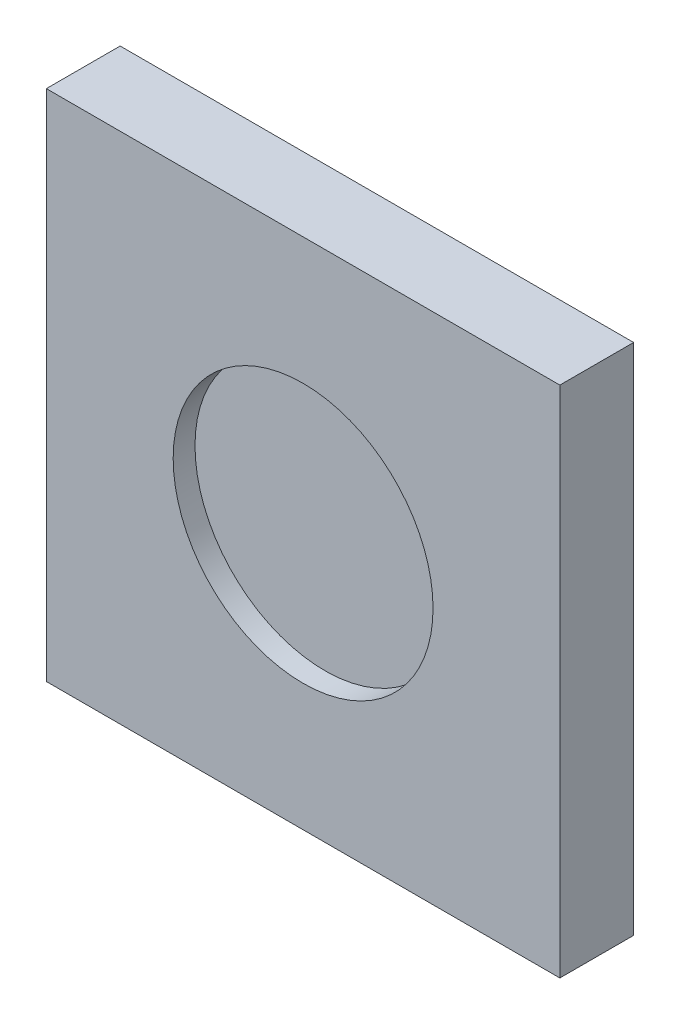
ISO-10303-21;
HEADER;
FILE_DESCRIPTION(('STEP AP214'),'2;1');
FILE_NAME('part.step','',(''),(''),'','','');
FILE_SCHEMA(('AUTOMOTIVE_DESIGN { 1 0 10303 214 1 1 1 1 }'));
ENDSEC;
DATA;
#1=APPLICATION_CONTEXT('core data for automotive mechanical design processes');
#2=APPLICATION_PROTOCOL_DEFINITION('international standard','automotive_design',2000,#1);
#3=PRODUCT_CONTEXT('',#1,'mechanical');
#4=PRODUCT('Part','Part','',(#3));
#5=PRODUCT_RELATED_PRODUCT_CATEGORY('part','',(#4));
#6=PRODUCT_DEFINITION_FORMATION('','',#4);
#7=PRODUCT_DEFINITION_CONTEXT('part definition',#1,'design');
#8=PRODUCT_DEFINITION('design','',#6,#7);
#9=PRODUCT_DEFINITION_SHAPE('','',#8);
#10=(LENGTH_UNIT() NAMED_UNIT(*) SI_UNIT(.MILLI.,.METRE.));
#11=(NAMED_UNIT(*) PLANE_ANGLE_UNIT() SI_UNIT($,.RADIAN.));
#12=(NAMED_UNIT(*) SI_UNIT($,.STERADIAN.) SOLID_ANGLE_UNIT());
#13=UNCERTAINTY_MEASURE_WITH_UNIT(LENGTH_MEASURE(1.E-05),#10,'distance_accuracy_value','');
#14=(GEOMETRIC_REPRESENTATION_CONTEXT(3) GLOBAL_UNCERTAINTY_ASSIGNED_CONTEXT((#13)) GLOBAL_UNIT_ASSIGNED_CONTEXT((#10,
#11,#12)) REPRESENTATION_CONTEXT('',''));
#15=CARTESIAN_POINT('',(0.,0.,0.));
#16=DIRECTION('',(0.,0.,1.));
#17=DIRECTION('',(1.,0.,0.));
#18=AXIS2_PLACEMENT_3D('',#15,#16,#17);
#19=CARTESIAN_POINT('',(24.7,24.7,7.1));
#20=DIRECTION('',(0.,0.,-1.));
#21=DIRECTION('',(-1.,0.,0.));
#22=AXIS2_PLACEMENT_3D('',#19,#20,#21);
#23=CYLINDRICAL_SURFACE('',#22,12.5);
#24=CARTESIAN_POINT('',(24.7,24.7,7.1));
#25=DIRECTION('',(0.,0.,1.));
#26=DIRECTION('',(1.,0.,0.));
#27=AXIS2_PLACEMENT_3D('',#24,#25,#26);
#28=CIRCLE('',#27,12.5);
#29=CARTESIAN_POINT('',(37.2,24.7,7.1));
#30=VERTEX_POINT('',#29);
#31=EDGE_CURVE('E100',#30,#30,#28,.T.);
#32=ORIENTED_EDGE('',*,*,#31,.T.);
#33=EDGE_LOOP('',(#32));
#34=FACE_BOUND('',#33,.T.);
#35=CARTESIAN_POINT('',(24.7,24.7,5.));
#36=DIRECTION('',(0.,0.,-1.));
#37=DIRECTION('',(-1.,0.,0.));
#38=AXIS2_PLACEMENT_3D('',#35,#36,#37);
#39=CIRCLE('',#38,12.5);
#40=CARTESIAN_POINT('',(12.2,24.7,5.));
#41=VERTEX_POINT('',#40);
#42=EDGE_CURVE('E113',#41,#41,#39,.T.);
#43=ORIENTED_EDGE('',*,*,#42,.T.);
#44=EDGE_LOOP('',(#43));
#45=FACE_BOUND('',#44,.T.);
#46=ADVANCED_FACE('F32',(#34,#45),#23,.F.);
#47=CARTESIAN_POINT('',(0.,49.4,7.1));
#48=DIRECTION('',(0.,0.,-1.));
#49=DIRECTION('',(-1.,0.,0.));
#50=AXIS2_PLACEMENT_3D('',#47,#48,#49);
#51=PLANE('',#50);
#52=DIRECTION('',(0.,-1.,0.));
#53=VECTOR('',#52,1.);
#54=CARTESIAN_POINT('',(0.,0.,7.1));
#55=LINE('',#54,#53);
#56=CARTESIAN_POINT('',(0.,49.4,7.1));
#57=VERTEX_POINT('',#56);
#58=CARTESIAN_POINT('',(0.,0.,7.1));
#59=VERTEX_POINT('',#58);
#60=EDGE_CURVE('E85',#57,#59,#55,.T.);
#61=ORIENTED_EDGE('',*,*,#60,.T.);
#62=DIRECTION('',(1.,0.,0.));
#63=VECTOR('',#62,1.);
#64=CARTESIAN_POINT('',(0.,0.,7.1));
#65=LINE('',#64,#63);
#66=CARTESIAN_POINT('',(49.4,0.,7.1));
#67=VERTEX_POINT('',#66);
#68=EDGE_CURVE('E79',#59,#67,#65,.T.);
#69=ORIENTED_EDGE('',*,*,#68,.T.);
#70=DIRECTION('',(0.,1.,0.));
#71=VECTOR('',#70,1.);
#72=CARTESIAN_POINT('',(49.4,0.,7.1));
#73=LINE('',#72,#71);
#74=CARTESIAN_POINT('',(49.4,49.4,7.1));
#75=VERTEX_POINT('',#74);
#76=EDGE_CURVE('E83',#67,#75,#73,.T.);
#77=ORIENTED_EDGE('',*,*,#76,.T.);
#78=DIRECTION('',(-1.,0.,0.));
#79=VECTOR('',#78,1.);
#80=CARTESIAN_POINT('',(0.,49.4,7.1));
#81=LINE('',#80,#79);
#82=EDGE_CURVE('E49',#75,#57,#81,.T.);
#83=ORIENTED_EDGE('',*,*,#82,.T.);
#84=EDGE_LOOP('',(#61,#69,#77,#83));
#85=FACE_BOUND('',#84,.T.);
#86=ORIENTED_EDGE('',*,*,#31,.F.);
#87=EDGE_LOOP('',(#86));
#88=FACE_BOUND('',#87,.T.);
#89=ADVANCED_FACE('F80',(#85,#88),#51,.F.);
#90=CARTESIAN_POINT('',(0.,49.4,0.));
#91=DIRECTION('',(0.,0.,-1.));
#92=DIRECTION('',(-1.,0.,0.));
#93=AXIS2_PLACEMENT_3D('',#90,#91,#92);
#94=PLANE('',#93);
#95=DIRECTION('',(0.,-1.,0.));
#96=VECTOR('',#95,1.);
#97=CARTESIAN_POINT('',(0.,0.,0.));
#98=LINE('',#97,#96);
#99=CARTESIAN_POINT('',(0.,49.4,0.));
#100=VERTEX_POINT('',#99);
#101=CARTESIAN_POINT('',(0.,0.,0.));
#102=VERTEX_POINT('',#101);
#103=EDGE_CURVE('E97',#100,#102,#98,.T.);
#104=ORIENTED_EDGE('',*,*,#103,.F.);
#105=DIRECTION('',(-1.,0.,0.));
#106=VECTOR('',#105,1.);
#107=CARTESIAN_POINT('',(0.,49.4,0.));
#108=LINE('',#107,#106);
#109=CARTESIAN_POINT('',(49.4,49.4,0.));
#110=VERTEX_POINT('',#109);
#111=EDGE_CURVE('E72',#110,#100,#108,.T.);
#112=ORIENTED_EDGE('',*,*,#111,.F.);
#113=DIRECTION('',(0.,1.,0.));
#114=VECTOR('',#113,1.);
#115=CARTESIAN_POINT('',(49.4,0.,0.));
#116=LINE('',#115,#114);
#117=CARTESIAN_POINT('',(49.4,0.,0.));
#118=VERTEX_POINT('',#117);
#119=EDGE_CURVE('E66',#118,#110,#116,.T.);
#120=ORIENTED_EDGE('',*,*,#119,.F.);
#121=DIRECTION('',(1.,0.,0.));
#122=VECTOR('',#121,1.);
#123=CARTESIAN_POINT('',(0.,0.,0.));
#124=LINE('',#123,#122);
#125=EDGE_CURVE('E89',#102,#118,#124,.T.);
#126=ORIENTED_EDGE('',*,*,#125,.F.);
#127=EDGE_LOOP('',(#104,#112,#120,#126));
#128=FACE_BOUND('',#127,.T.);
#129=ADVANCED_FACE('F108',(#128),#94,.T.);
#130=CARTESIAN_POINT('',(0.,0.,7.1));
#131=DIRECTION('',(1.,0.,0.));
#132=DIRECTION('',(0.,0.,-1.));
#133=AXIS2_PLACEMENT_3D('',#130,#131,#132);
#134=PLANE('',#133);
#135=ORIENTED_EDGE('',*,*,#103,.T.);
#136=DIRECTION('',(0.,0.,-1.));
#137=VECTOR('',#136,1.);
#138=CARTESIAN_POINT('',(0.,0.,7.1));
#139=LINE('',#138,#137);
#140=EDGE_CURVE('E11',#59,#102,#139,.T.);
#141=ORIENTED_EDGE('',*,*,#140,.F.);
#142=ORIENTED_EDGE('',*,*,#60,.F.);
#143=DIRECTION('',(0.,0.,-1.));
#144=VECTOR('',#143,1.);
#145=CARTESIAN_POINT('',(0.,49.4,7.1));
#146=LINE('',#145,#144);
#147=EDGE_CURVE('E93',#57,#100,#146,.T.);
#148=ORIENTED_EDGE('',*,*,#147,.T.);
#149=EDGE_LOOP('',(#135,#141,#142,#148));
#150=FACE_BOUND('',#149,.T.);
#151=ADVANCED_FACE('F34',(#150),#134,.F.);
#152=CARTESIAN_POINT('',(0.,0.,7.1));
#153=DIRECTION('',(0.,1.,0.));
#154=DIRECTION('',(0.,0.,1.));
#155=AXIS2_PLACEMENT_3D('',#152,#153,#154);
#156=PLANE('',#155);
#157=ORIENTED_EDGE('',*,*,#125,.T.);
#158=DIRECTION('',(0.,0.,-1.));
#159=VECTOR('',#158,1.);
#160=CARTESIAN_POINT('',(49.4,0.,7.1));
#161=LINE('',#160,#159);
#162=EDGE_CURVE('E41',#67,#118,#161,.T.);
#163=ORIENTED_EDGE('',*,*,#162,.F.);
#164=ORIENTED_EDGE('',*,*,#68,.F.);
#165=ORIENTED_EDGE('',*,*,#140,.T.);
#166=EDGE_LOOP('',(#157,#163,#164,#165));
#167=FACE_BOUND('',#166,.T.);
#168=ADVANCED_FACE('F88',(#167),#156,.F.);
#169=CARTESIAN_POINT('',(49.4,0.,7.1));
#170=DIRECTION('',(-1.,0.,0.));
#171=DIRECTION('',(0.,0.,1.));
#172=AXIS2_PLACEMENT_3D('',#169,#170,#171);
#173=PLANE('',#172);
#174=ORIENTED_EDGE('',*,*,#119,.T.);
#175=DIRECTION('',(0.,0.,-1.));
#176=VECTOR('',#175,1.);
#177=CARTESIAN_POINT('',(49.4,49.4,7.1));
#178=LINE('',#177,#176);
#179=EDGE_CURVE('E90',#75,#110,#178,.T.);
#180=ORIENTED_EDGE('',*,*,#179,.F.);
#181=ORIENTED_EDGE('',*,*,#76,.F.);
#182=ORIENTED_EDGE('',*,*,#162,.T.);
#183=EDGE_LOOP('',(#174,#180,#181,#182));
#184=FACE_BOUND('',#183,.T.);
#185=ADVANCED_FACE('F91',(#184),#173,.F.);
#186=CARTESIAN_POINT('',(0.,49.4,7.1));
#187=DIRECTION('',(0.,-1.,0.));
#188=DIRECTION('',(0.,0.,-1.));
#189=AXIS2_PLACEMENT_3D('',#186,#187,#188);
#190=PLANE('',#189);
#191=ORIENTED_EDGE('',*,*,#111,.T.);
#192=ORIENTED_EDGE('',*,*,#147,.F.);
#193=ORIENTED_EDGE('',*,*,#82,.F.);
#194=ORIENTED_EDGE('',*,*,#179,.T.);
#195=EDGE_LOOP('',(#191,#192,#193,#194));
#196=FACE_BOUND('',#195,.T.);
#197=ADVANCED_FACE('F105',(#196),#190,.F.);
#198=CARTESIAN_POINT('',(24.7,24.7,5.));
#199=DIRECTION('',(0.,0.,-1.));
#200=DIRECTION('',(-1.,0.,0.));
#201=AXIS2_PLACEMENT_3D('',#198,#199,#200);
#202=PLANE('',#201);
#203=ORIENTED_EDGE('',*,*,#42,.F.);
#204=EDGE_LOOP('',(#203));
#205=FACE_BOUND('',#204,.T.);
#206=ADVANCED_FACE('F118',(#205),#202,.F.);
#207=CLOSED_SHELL('',(#46,#89,#129,#151,#168,#185,#197,#206));
#208=MANIFOLD_SOLID_BREP('B2',#207);
#209=ADVANCED_BREP_SHAPE_REPRESENTATION('',(#18,#208),#14);
#210=SHAPE_DEFINITION_REPRESENTATION(#9,#209);
ENDSEC;
END-ISO-10303-21;
